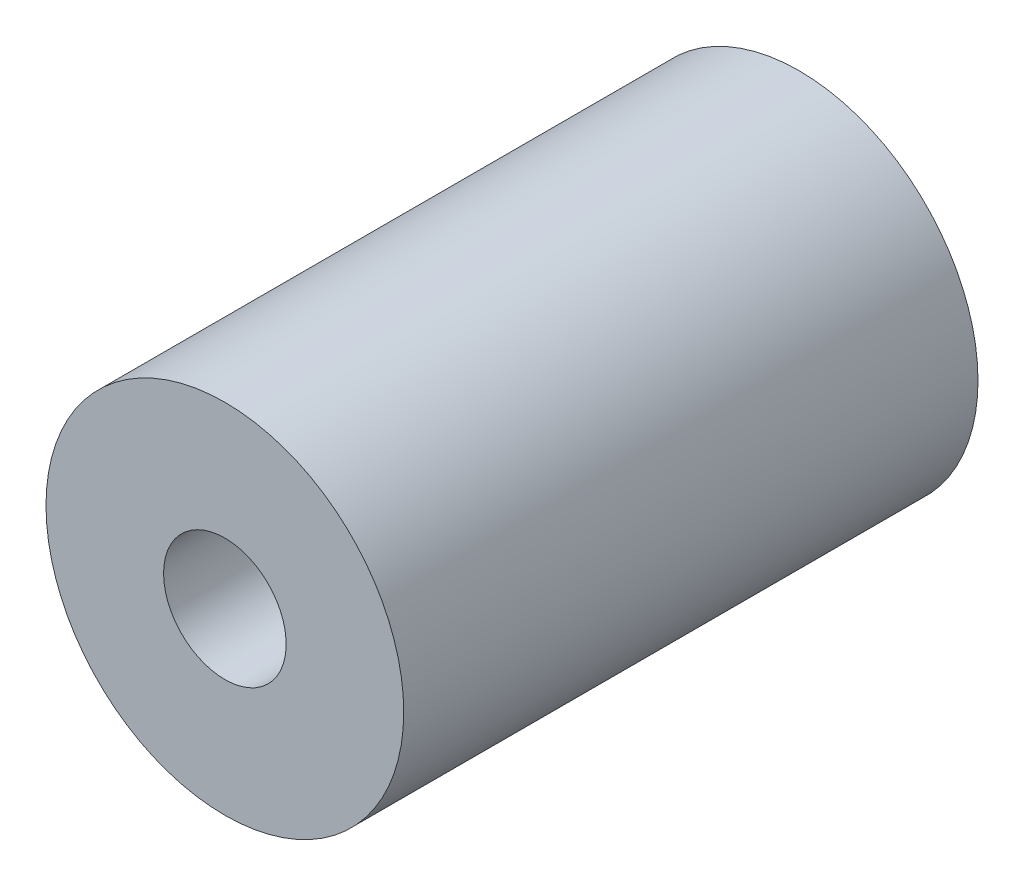
ISO-10303-21;
HEADER;
FILE_DESCRIPTION(('STEP AP214'),'2;1');
FILE_NAME('part.step','',(''),(''),'','','');
FILE_SCHEMA(('AUTOMOTIVE_DESIGN { 1 0 10303 214 1 1 1 1 }'));
ENDSEC;
DATA;
#1=APPLICATION_CONTEXT('core data for automotive mechanical design processes');
#2=APPLICATION_PROTOCOL_DEFINITION('international standard','automotive_design',2000,#1);
#3=PRODUCT_CONTEXT('',#1,'mechanical');
#4=PRODUCT('Part','Part','',(#3));
#5=PRODUCT_RELATED_PRODUCT_CATEGORY('part','',(#4));
#6=PRODUCT_DEFINITION_FORMATION('','',#4);
#7=PRODUCT_DEFINITION_CONTEXT('part definition',#1,'design');
#8=PRODUCT_DEFINITION('design','',#6,#7);
#9=PRODUCT_DEFINITION_SHAPE('','',#8);
#10=(LENGTH_UNIT() NAMED_UNIT(*) SI_UNIT(.MILLI.,.METRE.));
#11=(NAMED_UNIT(*) PLANE_ANGLE_UNIT() SI_UNIT($,.RADIAN.));
#12=(NAMED_UNIT(*) SI_UNIT($,.STERADIAN.) SOLID_ANGLE_UNIT());
#13=UNCERTAINTY_MEASURE_WITH_UNIT(LENGTH_MEASURE(1.E-05),#10,'distance_accuracy_value','');
#14=(GEOMETRIC_REPRESENTATION_CONTEXT(3) GLOBAL_UNCERTAINTY_ASSIGNED_CONTEXT((#13)) GLOBAL_UNIT_ASSIGNED_CONTEXT((#10,
#11,#12)) REPRESENTATION_CONTEXT('',''));
#15=CARTESIAN_POINT('',(0.,0.,0.));
#16=DIRECTION('',(0.,0.,1.));
#17=DIRECTION('',(1.,0.,0.));
#18=AXIS2_PLACEMENT_3D('',#15,#16,#17);
#19=CARTESIAN_POINT('',(0.,0.,-21.7308816762368));
#20=DIRECTION('',(0.,0.,-1.));
#21=DIRECTION('',(-1.,0.,0.));
#22=AXIS2_PLACEMENT_3D('',#19,#20,#21);
#23=CYLINDRICAL_SURFACE('',#22,9.525);
#24=CARTESIAN_POINT('',(0.,0.,15.2908));
#25=DIRECTION('',(0.,0.,-1.));
#26=DIRECTION('',(-1.,0.,0.));
#27=AXIS2_PLACEMENT_3D('',#24,#25,#26);
#28=CIRCLE('',#27,9.525);
#29=CARTESIAN_POINT('',(-9.525,0.,15.2908));
#30=VERTEX_POINT('',#29);
#31=EDGE_CURVE('E46',#30,#30,#28,.T.);
#32=ORIENTED_EDGE('',*,*,#31,.T.);
#33=EDGE_LOOP('',(#32));
#34=FACE_BOUND('',#33,.T.);
#35=CARTESIAN_POINT('',(0.,0.,-15.2908));
#36=DIRECTION('',(0.,0.,-1.));
#37=DIRECTION('',(-1.,0.,0.));
#38=AXIS2_PLACEMENT_3D('',#35,#36,#37);
#39=CIRCLE('',#38,9.525);
#40=CARTESIAN_POINT('',(-9.525,0.,-15.2908));
#41=VERTEX_POINT('',#40);
#42=EDGE_CURVE('E10',#41,#41,#39,.T.);
#43=ORIENTED_EDGE('',*,*,#42,.F.);
#44=EDGE_LOOP('',(#43));
#45=FACE_BOUND('',#44,.T.);
#46=ADVANCED_FACE('F32',(#34,#45),#23,.T.);
#47=CARTESIAN_POINT('',(0.,9.525,-15.2908));
#48=DIRECTION('',(0.,0.,-1.));
#49=DIRECTION('',(-1.,0.,0.));
#50=AXIS2_PLACEMENT_3D('',#47,#48,#49);
#51=PLANE('',#50);
#52=ORIENTED_EDGE('',*,*,#42,.T.);
#53=EDGE_LOOP('',(#52));
#54=FACE_BOUND('',#53,.T.);
#55=CARTESIAN_POINT('',(0.,0.,-15.2908));
#56=DIRECTION('',(0.,0.,-1.));
#57=DIRECTION('',(-1.,0.,0.));
#58=AXIS2_PLACEMENT_3D('',#55,#56,#57);
#59=CIRCLE('',#58,3.2639);
#60=CARTESIAN_POINT('',(-3.2639,0.,-15.2908));
#61=VERTEX_POINT('',#60);
#62=EDGE_CURVE('E38',#61,#61,#59,.T.);
#63=ORIENTED_EDGE('',*,*,#62,.F.);
#64=EDGE_LOOP('',(#63));
#65=FACE_BOUND('',#64,.T.);
#66=ADVANCED_FACE('F62',(#54,#65),#51,.T.);
#67=CARTESIAN_POINT('',(0.,0.,-21.7308816762368));
#68=DIRECTION('',(0.,0.,-1.));
#69=DIRECTION('',(-1.,0.,0.));
#70=AXIS2_PLACEMENT_3D('',#67,#68,#69);
#71=CYLINDRICAL_SURFACE('',#70,3.2639);
#72=ORIENTED_EDGE('',*,*,#62,.T.);
#73=EDGE_LOOP('',(#72));
#74=FACE_BOUND('',#73,.T.);
#75=CARTESIAN_POINT('',(0.,0.,15.2908));
#76=DIRECTION('',(0.,0.,-1.));
#77=DIRECTION('',(-1.,0.,0.));
#78=AXIS2_PLACEMENT_3D('',#75,#76,#77);
#79=CIRCLE('',#78,3.2639);
#80=CARTESIAN_POINT('',(-3.2639,0.,15.2908));
#81=VERTEX_POINT('',#80);
#82=EDGE_CURVE('E42',#81,#81,#79,.T.);
#83=ORIENTED_EDGE('',*,*,#82,.F.);
#84=EDGE_LOOP('',(#83));
#85=FACE_BOUND('',#84,.T.);
#86=ADVANCED_FACE('F56',(#74,#85),#71,.F.);
#87=CARTESIAN_POINT('',(0.,9.525,15.2908));
#88=DIRECTION('',(0.,0.,1.));
#89=DIRECTION('',(1.,0.,0.));
#90=AXIS2_PLACEMENT_3D('',#87,#88,#89);
#91=PLANE('',#90);
#92=ORIENTED_EDGE('',*,*,#82,.T.);
#93=EDGE_LOOP('',(#92));
#94=FACE_BOUND('',#93,.T.);
#95=ORIENTED_EDGE('',*,*,#31,.F.);
#96=EDGE_LOOP('',(#95));
#97=FACE_BOUND('',#96,.T.);
#98=ADVANCED_FACE('F54',(#94,#97),#91,.T.);
#99=CLOSED_SHELL('',(#46,#66,#86,#98));
#100=MANIFOLD_SOLID_BREP('B2',#99);
#101=ADVANCED_BREP_SHAPE_REPRESENTATION('',(#18,#100),#14);
#102=SHAPE_DEFINITION_REPRESENTATION(#9,#101);
ENDSEC;
END-ISO-10303-21;
